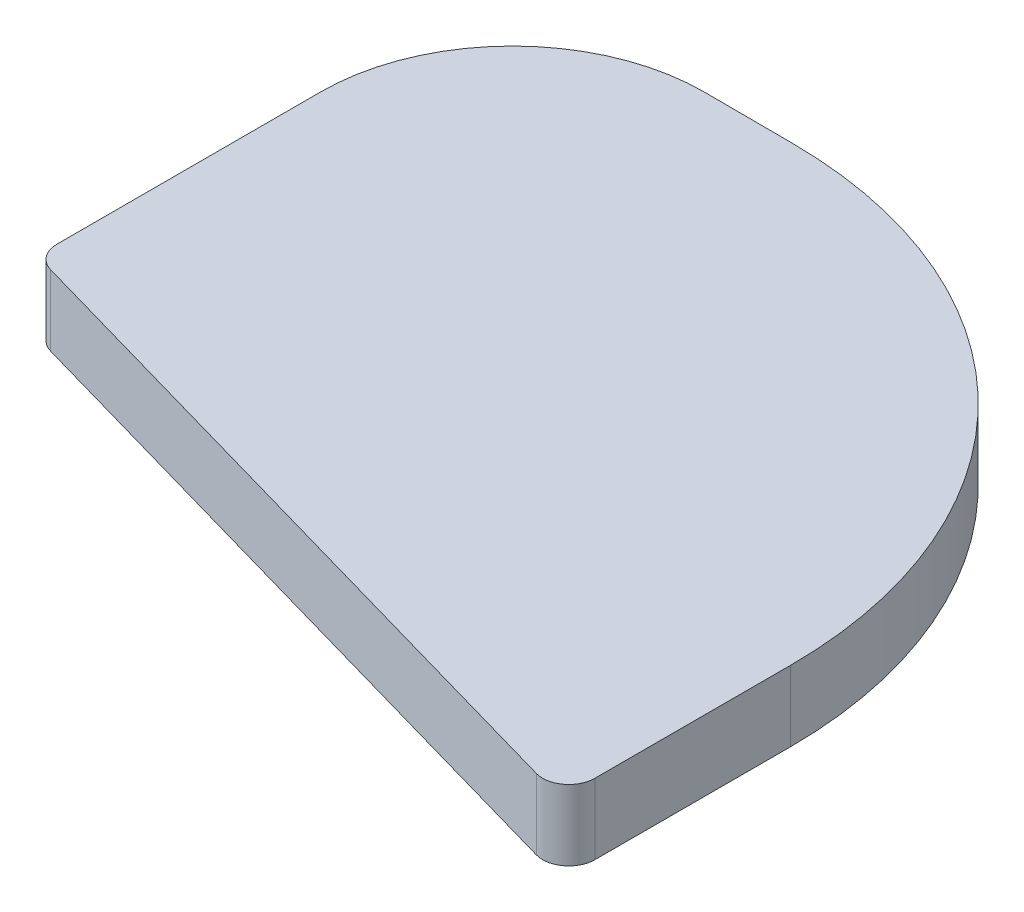
ISO-10303-21;
HEADER;
FILE_DESCRIPTION(('STEP AP214'),'2;1');
FILE_NAME('part.step','',(''),(''),'','','');
FILE_SCHEMA(('AUTOMOTIVE_DESIGN { 1 0 10303 214 1 1 1 1 }'));
ENDSEC;
DATA;
#1=APPLICATION_CONTEXT('core data for automotive mechanical design processes');
#2=APPLICATION_PROTOCOL_DEFINITION('international standard','automotive_design',2000,#1);
#3=PRODUCT_CONTEXT('',#1,'mechanical');
#4=PRODUCT('Part','Part','',(#3));
#5=PRODUCT_RELATED_PRODUCT_CATEGORY('part','',(#4));
#6=PRODUCT_DEFINITION_FORMATION('','',#4);
#7=PRODUCT_DEFINITION_CONTEXT('part definition',#1,'design');
#8=PRODUCT_DEFINITION('design','',#6,#7);
#9=PRODUCT_DEFINITION_SHAPE('','',#8);
#10=(LENGTH_UNIT() NAMED_UNIT(*) SI_UNIT(.MILLI.,.METRE.));
#11=(NAMED_UNIT(*) PLANE_ANGLE_UNIT() SI_UNIT($,.RADIAN.));
#12=(NAMED_UNIT(*) SI_UNIT($,.STERADIAN.) SOLID_ANGLE_UNIT());
#13=UNCERTAINTY_MEASURE_WITH_UNIT(LENGTH_MEASURE(1.E-05),#10,'distance_accuracy_value','');
#14=(GEOMETRIC_REPRESENTATION_CONTEXT(3) GLOBAL_UNCERTAINTY_ASSIGNED_CONTEXT((#13)) GLOBAL_UNIT_ASSIGNED_CONTEXT((#10,
#11,#12)) REPRESENTATION_CONTEXT('',''));
#15=CARTESIAN_POINT('',(0.,0.,0.));
#16=DIRECTION('',(0.,0.,1.));
#17=DIRECTION('',(1.,0.,0.));
#18=AXIS2_PLACEMENT_3D('',#15,#16,#17);
#19=CARTESIAN_POINT('',(-1.4260581804579,2.9906,-4.2242901276449));
#20=DIRECTION('',(0.,-1.,0.));
#21=DIRECTION('',(-1.,0.,0.));
#22=AXIS2_PLACEMENT_3D('',#19,#20,#21);
#23=CYLINDRICAL_SURFACE('',#22,0.385117596946208);
#24=CARTESIAN_POINT('',(-1.4260581804579,2.9306,-4.2242901276449));
#25=DIRECTION('',(0.,1.,0.));
#26=DIRECTION('',(1.,0.,0.));
#27=AXIS2_PLACEMENT_3D('',#24,#25,#26);
#28=CIRCLE('',#27,0.385117596946208);
#29=CARTESIAN_POINT('',(-1.0409405835117,2.9306,-4.2242901276449));
#30=VERTEX_POINT('',#29);
#31=CARTESIAN_POINT('',(-1.4246550431291,2.9306,-4.6094051684876));
#32=VERTEX_POINT('',#31);
#33=EDGE_CURVE('E11',#30,#32,#28,.T.);
#34=ORIENTED_EDGE('',*,*,#33,.T.);
#35=DIRECTION('',(0.,-1.,0.));
#36=VECTOR('',#35,1.);
#37=CARTESIAN_POINT('',(-1.4246550431291,2.9906,-4.6094051684876));
#38=LINE('',#37,#36);
#39=CARTESIAN_POINT('',(-1.4246550431291,2.9906,-4.6094051684876));
#40=VERTEX_POINT('',#39);
#41=EDGE_CURVE('E24',#40,#32,#38,.T.);
#42=ORIENTED_EDGE('',*,*,#41,.F.);
#43=CARTESIAN_POINT('',(-1.4260581804579,2.9906,-4.2242901276449));
#44=DIRECTION('',(0.,1.,0.));
#45=DIRECTION('',(1.,0.,0.));
#46=AXIS2_PLACEMENT_3D('',#43,#44,#45);
#47=CIRCLE('',#46,0.385117596946208);
#48=CARTESIAN_POINT('',(-1.0409405835117,2.9906,-4.2242901276449));
#49=VERTEX_POINT('',#48);
#50=EDGE_CURVE('E144',#49,#40,#47,.T.);
#51=ORIENTED_EDGE('',*,*,#50,.F.);
#52=DIRECTION('',(0.,-1.,0.));
#53=VECTOR('',#52,1.);
#54=CARTESIAN_POINT('',(-1.0409405835117,2.9906,-4.2242901276449));
#55=LINE('',#54,#53);
#56=EDGE_CURVE('E102',#49,#30,#55,.T.);
#57=ORIENTED_EDGE('',*,*,#56,.T.);
#58=EDGE_LOOP('',(#34,#42,#51,#57));
#59=FACE_BOUND('',#58,.T.);
#60=ADVANCED_FACE('F17',(#59),#23,.T.);
#61=CARTESIAN_POINT('',(-1.4246550431291,2.9906,-4.6094051684876));
#62=DIRECTION('',(-0.003643399677989,0.,0.999993362797367));
#63=DIRECTION('',(0.999993362797367,0.,0.003643399677989));
#64=AXIS2_PLACEMENT_3D('',#61,#62,#63);
#65=PLANE('',#64);
#66=DIRECTION('',(-0.999993362797367,0.,-0.003643399677989));
#67=VECTOR('',#66,1.);
#68=CARTESIAN_POINT('',(-1.4246550431291,2.9306,-4.6094051684876));
#69=LINE('',#68,#67);
#70=CARTESIAN_POINT('',(-1.499351122484,2.9306,-4.6096773179654));
#71=VERTEX_POINT('',#70);
#72=EDGE_CURVE('E141',#32,#71,#69,.T.);
#73=ORIENTED_EDGE('',*,*,#72,.T.);
#74=DIRECTION('',(0.,-1.,0.));
#75=VECTOR('',#74,1.);
#76=CARTESIAN_POINT('',(-1.499351122484,2.9906,-4.6096773179654));
#77=LINE('',#76,#75);
#78=CARTESIAN_POINT('',(-1.499351122484,2.9906,-4.6096773179654));
#79=VERTEX_POINT('',#78);
#80=EDGE_CURVE('E138',#79,#71,#77,.T.);
#81=ORIENTED_EDGE('',*,*,#80,.F.);
#82=DIRECTION('',(-0.999993362797367,0.,-0.003643399677989));
#83=VECTOR('',#82,1.);
#84=CARTESIAN_POINT('',(-1.4246550431291,2.9906,-4.6094051684876));
#85=LINE('',#84,#83);
#86=EDGE_CURVE('E135',#40,#79,#85,.T.);
#87=ORIENTED_EDGE('',*,*,#86,.F.);
#88=ORIENTED_EDGE('',*,*,#41,.T.);
#89=EDGE_LOOP('',(#73,#81,#87,#88));
#90=FACE_BOUND('',#89,.T.);
#91=ADVANCED_FACE('F147',(#90),#65,.F.);
#92=CARTESIAN_POINT('',(-1.4999447575078,2.9906,-4.446744031455));
#93=DIRECTION('',(0.,-1.,0.));
#94=DIRECTION('',(-1.,0.,0.));
#95=AXIS2_PLACEMENT_3D('',#92,#93,#94);
#96=CYLINDRICAL_SURFACE('',#95,0.1629343679388);
#97=CARTESIAN_POINT('',(-1.4999447575078,2.9306,-4.446744031455));
#98=DIRECTION('',(0.,1.,0.));
#99=DIRECTION('',(1.,0.,0.));
#100=AXIS2_PLACEMENT_3D('',#97,#98,#99);
#101=CIRCLE('',#100,0.1629343679388);
#102=CARTESIAN_POINT('',(-1.6628791254466,2.9306,-4.446744031455));
#103=VERTEX_POINT('',#102);
#104=EDGE_CURVE('E133',#71,#103,#101,.T.);
#105=ORIENTED_EDGE('',*,*,#104,.T.);
#106=DIRECTION('',(0.,-1.,0.));
#107=VECTOR('',#106,1.);
#108=CARTESIAN_POINT('',(-1.6628791254466,2.9906,-4.446744031455));
#109=LINE('',#108,#107);
#110=CARTESIAN_POINT('',(-1.6628791254466,2.9906,-4.446744031455));
#111=VERTEX_POINT('',#110);
#112=EDGE_CURVE('E130',#111,#103,#109,.T.);
#113=ORIENTED_EDGE('',*,*,#112,.F.);
#114=CARTESIAN_POINT('',(-1.4999447575078,2.9906,-4.446744031455));
#115=DIRECTION('',(0.,1.,0.));
#116=DIRECTION('',(1.,0.,0.));
#117=AXIS2_PLACEMENT_3D('',#114,#115,#116);
#118=CIRCLE('',#117,0.1629343679388);
#119=EDGE_CURVE('E127',#79,#111,#118,.T.);
#120=ORIENTED_EDGE('',*,*,#119,.F.);
#121=ORIENTED_EDGE('',*,*,#80,.T.);
#122=EDGE_LOOP('',(#105,#113,#120,#121));
#123=FACE_BOUND('',#122,.T.);
#124=ADVANCED_FACE('F153',(#123),#96,.T.);
#125=CARTESIAN_POINT('',(-1.6628791254466,2.9906,-4.446744031455));
#126=DIRECTION('',(1.,0.,0.));
#127=DIRECTION('',(0.,-1.,0.));
#128=AXIS2_PLACEMENT_3D('',#125,#126,#127);
#129=PLANE('',#128);
#130=DIRECTION('',(0.,0.,1.));
#131=VECTOR('',#130,1.);
#132=CARTESIAN_POINT('',(-1.6628791254466,2.9306,-4.446744031455));
#133=LINE('',#132,#131);
#134=CARTESIAN_POINT('',(-1.6628791254466,2.9306,-4.2223226302451));
#135=VERTEX_POINT('',#134);
#136=EDGE_CURVE('E125',#103,#135,#133,.T.);
#137=ORIENTED_EDGE('',*,*,#136,.T.);
#138=DIRECTION('',(0.,-1.,0.));
#139=VECTOR('',#138,1.);
#140=CARTESIAN_POINT('',(-1.6628791254466,2.9906,-4.2223226302451));
#141=LINE('',#140,#139);
#142=CARTESIAN_POINT('',(-1.6628791254466,2.9906,-4.2223226302451));
#143=VERTEX_POINT('',#142);
#144=EDGE_CURVE('E122',#143,#135,#141,.T.);
#145=ORIENTED_EDGE('',*,*,#144,.F.);
#146=DIRECTION('',(0.,0.,1.));
#147=VECTOR('',#146,1.);
#148=CARTESIAN_POINT('',(-1.6628791254466,2.9906,-4.446744031455));
#149=LINE('',#148,#147);
#150=EDGE_CURVE('E119',#111,#143,#149,.T.);
#151=ORIENTED_EDGE('',*,*,#150,.F.);
#152=ORIENTED_EDGE('',*,*,#112,.T.);
#153=EDGE_LOOP('',(#137,#145,#151,#152));
#154=FACE_BOUND('',#153,.T.);
#155=ADVANCED_FACE('F157',(#154),#129,.F.);
#156=CARTESIAN_POINT('',(-1.6406608025458,2.9906,-4.2223226302452));
#157=DIRECTION('',(0.,-1.,0.));
#158=DIRECTION('',(-1.,0.,0.));
#159=AXIS2_PLACEMENT_3D('',#156,#157,#158);
#160=CYLINDRICAL_SURFACE('',#159,0.0222183229007722);
#161=CARTESIAN_POINT('',(-1.6406608025458,2.9306,-4.2223226302452));
#162=DIRECTION('',(0.,1.,0.));
#163=DIRECTION('',(1.,0.,0.));
#164=AXIS2_PLACEMENT_3D('',#161,#162,#163);
#165=CIRCLE('',#164,0.0222183229007722);
#166=CARTESIAN_POINT('',(-1.6467456826305,2.9306,-4.2009537719023));
#167=VERTEX_POINT('',#166);
#168=EDGE_CURVE('E117',#135,#167,#165,.T.);
#169=ORIENTED_EDGE('',*,*,#168,.T.);
#170=DIRECTION('',(0.,-1.,0.));
#171=VECTOR('',#170,1.);
#172=CARTESIAN_POINT('',(-1.6467456826305,2.9906,-4.2009537719023));
#173=LINE('',#172,#171);
#174=CARTESIAN_POINT('',(-1.6467456826305,2.9906,-4.2009537719023));
#175=VERTEX_POINT('',#174);
#176=EDGE_CURVE('E114',#175,#167,#173,.T.);
#177=ORIENTED_EDGE('',*,*,#176,.F.);
#178=CARTESIAN_POINT('',(-1.6406608025458,2.9906,-4.2223226302452));
#179=DIRECTION('',(0.,1.,0.));
#180=DIRECTION('',(1.,0.,0.));
#181=AXIS2_PLACEMENT_3D('',#178,#179,#180);
#182=CIRCLE('',#181,0.0222183229007722);
#183=EDGE_CURVE('E112',#143,#175,#182,.T.);
#184=ORIENTED_EDGE('',*,*,#183,.F.);
#185=ORIENTED_EDGE('',*,*,#144,.T.);
#186=EDGE_LOOP('',(#169,#177,#184,#185));
#187=FACE_BOUND('',#186,.T.);
#188=ADVANCED_FACE('F160',(#187),#160,.T.);
#189=CARTESIAN_POINT('',(-1.6467456826305,2.9906,-4.2009537719023));
#190=DIRECTION('',(0.273867659223355,0.,-0.961767386238232));
#191=DIRECTION('',(-0.961767386238232,0.,-0.273867659223355));
#192=AXIS2_PLACEMENT_3D('',#189,#190,#191);
#193=PLANE('',#192);
#194=DIRECTION('',(0.961767386238232,0.,0.273867659223355));
#195=VECTOR('',#194,1.);
#196=CARTESIAN_POINT('',(-1.6467456826305,2.9306,-4.2009537719023));
#197=LINE('',#196,#195);
#198=CARTESIAN_POINT('',(-1.0692437864971,2.9306,-4.0365074673653));
#199=VERTEX_POINT('',#198);
#200=EDGE_CURVE('E110',#167,#199,#197,.T.);
#201=ORIENTED_EDGE('',*,*,#200,.T.);
#202=DIRECTION('',(0.,-1.,0.));
#203=VECTOR('',#202,1.);
#204=CARTESIAN_POINT('',(-1.0692437864971,2.9906,-4.0365074673653));
#205=LINE('',#204,#203);
#206=CARTESIAN_POINT('',(-1.0692437864971,2.9906,-4.0365074673653));
#207=VERTEX_POINT('',#206);
#208=EDGE_CURVE('E108',#207,#199,#205,.T.);
#209=ORIENTED_EDGE('',*,*,#208,.F.);
#210=DIRECTION('',(0.961767386238232,0.,0.273867659223355));
#211=VECTOR('',#210,1.);
#212=CARTESIAN_POINT('',(-1.6467456826305,2.9906,-4.2009537719023));
#213=LINE('',#212,#211);
#214=EDGE_CURVE('E97',#175,#207,#213,.T.);
#215=ORIENTED_EDGE('',*,*,#214,.F.);
#216=ORIENTED_EDGE('',*,*,#176,.T.);
#217=EDGE_LOOP('',(#201,#209,#215,#216));
#218=FACE_BOUND('',#217,.T.);
#219=ADVANCED_FACE('F163',(#218),#193,.F.);
#220=CARTESIAN_POINT('',(-1.0631589064124,2.9906,-4.0578763257081));
#221=DIRECTION('',(0.,-1.,0.));
#222=DIRECTION('',(-1.,0.,0.));
#223=AXIS2_PLACEMENT_3D('',#220,#221,#222);
#224=CYLINDRICAL_SURFACE('',#223,0.0222183229007179);
#225=CARTESIAN_POINT('',(-1.0631589064124,2.9306,-4.0578763257081));
#226=DIRECTION('',(0.,1.,0.));
#227=DIRECTION('',(1.,0.,0.));
#228=AXIS2_PLACEMENT_3D('',#225,#226,#227);
#229=CIRCLE('',#228,0.0222183229007179);
#230=CARTESIAN_POINT('',(-1.0409405835117,2.9306,-4.0578763257081));
#231=VERTEX_POINT('',#230);
#232=EDGE_CURVE('E84',#199,#231,#229,.T.);
#233=ORIENTED_EDGE('',*,*,#232,.T.);
#234=DIRECTION('',(0.,-1.,0.));
#235=VECTOR('',#234,1.);
#236=CARTESIAN_POINT('',(-1.0409405835117,2.9906,-4.0578763257081));
#237=LINE('',#236,#235);
#238=CARTESIAN_POINT('',(-1.0409405835117,2.9906,-4.0578763257081));
#239=VERTEX_POINT('',#238);
#240=EDGE_CURVE('E78',#239,#231,#237,.T.);
#241=ORIENTED_EDGE('',*,*,#240,.F.);
#242=CARTESIAN_POINT('',(-1.0631589064124,2.9906,-4.0578763257081));
#243=DIRECTION('',(0.,1.,0.));
#244=DIRECTION('',(1.,0.,0.));
#245=AXIS2_PLACEMENT_3D('',#242,#243,#244);
#246=CIRCLE('',#245,0.0222183229007179);
#247=EDGE_CURVE('E82',#207,#239,#246,.T.);
#248=ORIENTED_EDGE('',*,*,#247,.F.);
#249=ORIENTED_EDGE('',*,*,#208,.T.);
#250=EDGE_LOOP('',(#233,#241,#248,#249));
#251=FACE_BOUND('',#250,.T.);
#252=ADVANCED_FACE('F80',(#251),#224,.T.);
#253=CARTESIAN_POINT('',(-1.0409405835117,2.9906,-4.0578763257081));
#254=DIRECTION('',(-1.,0.,0.));
#255=DIRECTION('',(0.,1.,0.));
#256=AXIS2_PLACEMENT_3D('',#253,#254,#255);
#257=PLANE('',#256);
#258=DIRECTION('',(0.,0.,-1.));
#259=VECTOR('',#258,1.);
#260=CARTESIAN_POINT('',(-1.0409405835117,2.9306,-4.0578763257081));
#261=LINE('',#260,#259);
#262=EDGE_CURVE('E98',#231,#30,#261,.T.);
#263=ORIENTED_EDGE('',*,*,#262,.T.);
#264=ORIENTED_EDGE('',*,*,#56,.F.);
#265=DIRECTION('',(0.,0.,-1.));
#266=VECTOR('',#265,1.);
#267=CARTESIAN_POINT('',(-1.0409405835117,2.9906,-4.0578763257081));
#268=LINE('',#267,#266);
#269=EDGE_CURVE('E94',#239,#49,#268,.T.);
#270=ORIENTED_EDGE('',*,*,#269,.F.);
#271=ORIENTED_EDGE('',*,*,#240,.T.);
#272=EDGE_LOOP('',(#263,#264,#270,#271));
#273=FACE_BOUND('',#272,.T.);
#274=ADVANCED_FACE('F101',(#273),#257,.F.);
#275=CARTESIAN_POINT('',(-1.4260581804579,2.9906,-4.2242901276449));
#276=DIRECTION('',(0.,1.,0.));
#277=DIRECTION('',(1.,0.,0.));
#278=AXIS2_PLACEMENT_3D('',#275,#276,#277);
#279=PLANE('',#278);
#280=ORIENTED_EDGE('',*,*,#50,.T.);
#281=ORIENTED_EDGE('',*,*,#86,.T.);
#282=ORIENTED_EDGE('',*,*,#119,.T.);
#283=ORIENTED_EDGE('',*,*,#150,.T.);
#284=ORIENTED_EDGE('',*,*,#183,.T.);
#285=ORIENTED_EDGE('',*,*,#214,.T.);
#286=ORIENTED_EDGE('',*,*,#247,.T.);
#287=ORIENTED_EDGE('',*,*,#269,.T.);
#288=EDGE_LOOP('',(#280,#281,#282,#283,#284,#285,#286,#287));
#289=FACE_BOUND('',#288,.T.);
#290=ADVANCED_FACE('F93',(#289),#279,.T.);
#291=CARTESIAN_POINT('',(-1.4260581804579,2.9306,-4.2242901276449));
#292=DIRECTION('',(0.,1.,0.));
#293=DIRECTION('',(1.,0.,0.));
#294=AXIS2_PLACEMENT_3D('',#291,#292,#293);
#295=PLANE('',#294);
#296=ORIENTED_EDGE('',*,*,#33,.F.);
#297=ORIENTED_EDGE('',*,*,#262,.F.);
#298=ORIENTED_EDGE('',*,*,#232,.F.);
#299=ORIENTED_EDGE('',*,*,#200,.F.);
#300=ORIENTED_EDGE('',*,*,#168,.F.);
#301=ORIENTED_EDGE('',*,*,#136,.F.);
#302=ORIENTED_EDGE('',*,*,#104,.F.);
#303=ORIENTED_EDGE('',*,*,#72,.F.);
#304=EDGE_LOOP('',(#296,#297,#298,#299,#300,#301,#302,#303));
#305=FACE_BOUND('',#304,.T.);
#306=ADVANCED_FACE('F149',(#305),#295,.F.);
#307=CLOSED_SHELL('',(#60,#91,#124,#155,#188,#219,#252,#274,#290,#306));
#308=MANIFOLD_SOLID_BREP('B1',#307);
#309=ADVANCED_BREP_SHAPE_REPRESENTATION('',(#18,#308),#14);
#310=SHAPE_DEFINITION_REPRESENTATION(#9,#309);
ENDSEC;
END-ISO-10303-21;
